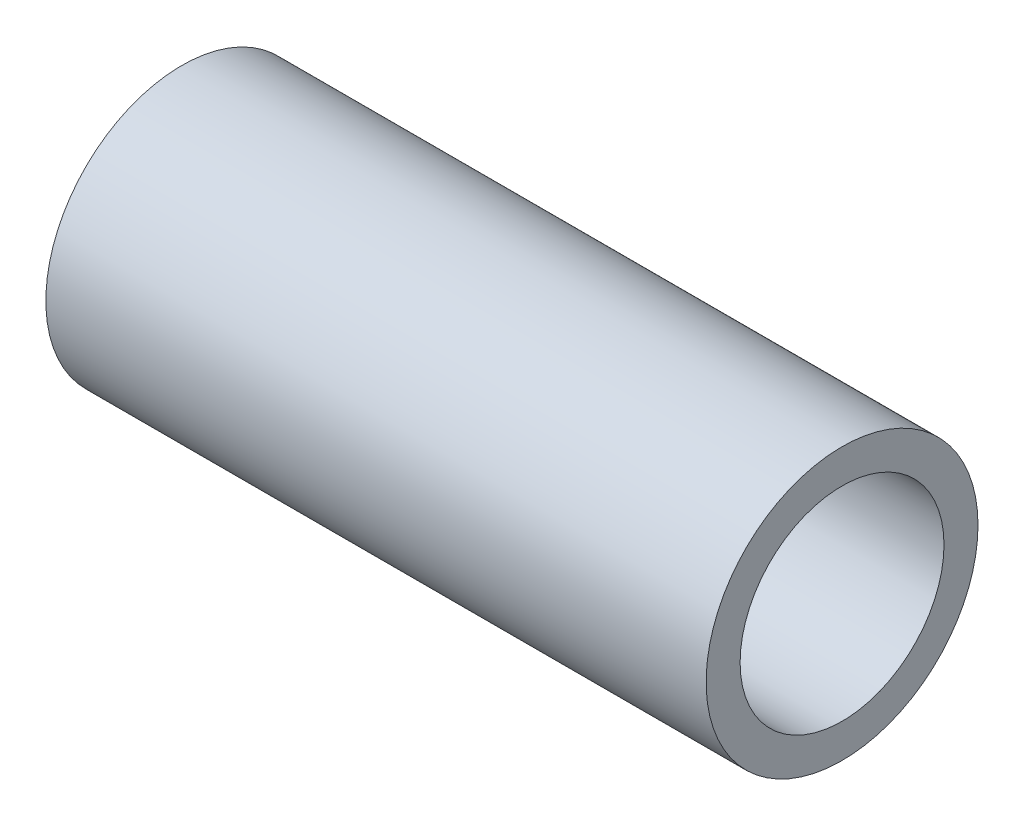
ISO-10303-21;
HEADER;
FILE_DESCRIPTION(('STEP AP214'),'2;1');
FILE_NAME('part.step','',(''),(''),'','','');
FILE_SCHEMA(('AUTOMOTIVE_DESIGN { 1 0 10303 214 1 1 1 1 }'));
ENDSEC;
DATA;
#1=APPLICATION_CONTEXT('core data for automotive mechanical design processes');
#2=APPLICATION_PROTOCOL_DEFINITION('international standard','automotive_design',2000,#1);
#3=PRODUCT_CONTEXT('',#1,'mechanical');
#4=PRODUCT('Part','Part','',(#3));
#5=PRODUCT_RELATED_PRODUCT_CATEGORY('part','',(#4));
#6=PRODUCT_DEFINITION_FORMATION('','',#4);
#7=PRODUCT_DEFINITION_CONTEXT('part definition',#1,'design');
#8=PRODUCT_DEFINITION('design','',#6,#7);
#9=PRODUCT_DEFINITION_SHAPE('','',#8);
#10=(LENGTH_UNIT() NAMED_UNIT(*) SI_UNIT(.MILLI.,.METRE.));
#11=(NAMED_UNIT(*) PLANE_ANGLE_UNIT() SI_UNIT($,.RADIAN.));
#12=(NAMED_UNIT(*) SI_UNIT($,.STERADIAN.) SOLID_ANGLE_UNIT());
#13=UNCERTAINTY_MEASURE_WITH_UNIT(LENGTH_MEASURE(1.E-05),#10,'distance_accuracy_value','');
#14=(GEOMETRIC_REPRESENTATION_CONTEXT(3) GLOBAL_UNCERTAINTY_ASSIGNED_CONTEXT((#13)) GLOBAL_UNIT_ASSIGNED_CONTEXT((#10,
#11,#12)) REPRESENTATION_CONTEXT('',''));
#15=CARTESIAN_POINT('',(0.,0.,0.));
#16=DIRECTION('',(0.,0.,1.));
#17=DIRECTION('',(1.,0.,0.));
#18=AXIS2_PLACEMENT_3D('',#15,#16,#17);
#19=CARTESIAN_POINT('',(34.,0.,0.));
#20=DIRECTION('',(1.,0.,0.));
#21=DIRECTION('',(0.,0.,-1.));
#22=AXIS2_PLACEMENT_3D('',#19,#20,#21);
#23=PLANE('',#22);
#24=CARTESIAN_POINT('',(34.,0.,0.));
#25=DIRECTION('',(1.,0.,0.));
#26=DIRECTION('',(0.,0.,-1.));
#27=AXIS2_PLACEMENT_3D('',#24,#25,#26);
#28=CIRCLE('',#27,7.);
#29=CARTESIAN_POINT('',(34.,0.,-7.));
#30=VERTEX_POINT('',#29);
#31=EDGE_CURVE('E10',#30,#30,#28,.T.);
#32=ORIENTED_EDGE('',*,*,#31,.T.);
#33=EDGE_LOOP('',(#32));
#34=FACE_BOUND('',#33,.T.);
#35=CARTESIAN_POINT('',(34.,0.,0.));
#36=DIRECTION('',(1.,0.,0.));
#37=DIRECTION('',(0.,0.,-1.));
#38=AXIS2_PLACEMENT_3D('',#35,#36,#37);
#39=CIRCLE('',#38,5.25);
#40=CARTESIAN_POINT('',(34.,0.,-5.25));
#41=VERTEX_POINT('',#40);
#42=EDGE_CURVE('E54',#41,#41,#39,.T.);
#43=ORIENTED_EDGE('',*,*,#42,.F.);
#44=EDGE_LOOP('',(#43));
#45=FACE_BOUND('',#44,.T.);
#46=ADVANCED_FACE('F41',(#34,#45),#23,.T.);
#47=CARTESIAN_POINT('',(0.,0.,0.));
#48=DIRECTION('',(1.,0.,0.));
#49=DIRECTION('',(0.,0.,-1.));
#50=AXIS2_PLACEMENT_3D('',#47,#48,#49);
#51=PLANE('',#50);
#52=CARTESIAN_POINT('',(0.,0.,0.));
#53=DIRECTION('',(1.,0.,0.));
#54=DIRECTION('',(0.,0.,-1.));
#55=AXIS2_PLACEMENT_3D('',#52,#53,#54);
#56=CIRCLE('',#55,7.);
#57=CARTESIAN_POINT('',(0.,0.,-7.));
#58=VERTEX_POINT('',#57);
#59=EDGE_CURVE('E45',#58,#58,#56,.T.);
#60=ORIENTED_EDGE('',*,*,#59,.F.);
#61=EDGE_LOOP('',(#60));
#62=FACE_BOUND('',#61,.T.);
#63=CARTESIAN_POINT('',(0.,0.,0.));
#64=DIRECTION('',(1.,0.,0.));
#65=DIRECTION('',(0.,0.,-1.));
#66=AXIS2_PLACEMENT_3D('',#63,#64,#65);
#67=CIRCLE('',#66,5.25);
#68=CARTESIAN_POINT('',(0.,0.,-5.25));
#69=VERTEX_POINT('',#68);
#70=EDGE_CURVE('E56',#69,#69,#67,.T.);
#71=ORIENTED_EDGE('',*,*,#70,.T.);
#72=EDGE_LOOP('',(#71));
#73=FACE_BOUND('',#72,.T.);
#74=ADVANCED_FACE('F68',(#62,#73),#51,.F.);
#75=CARTESIAN_POINT('',(34.,0.,0.));
#76=DIRECTION('',(-1.,0.,0.));
#77=DIRECTION('',(0.,0.,1.));
#78=AXIS2_PLACEMENT_3D('',#75,#76,#77);
#79=CYLINDRICAL_SURFACE('',#78,7.);
#80=ORIENTED_EDGE('',*,*,#31,.F.);
#81=EDGE_LOOP('',(#80));
#82=FACE_BOUND('',#81,.T.);
#83=ORIENTED_EDGE('',*,*,#59,.T.);
#84=EDGE_LOOP('',(#83));
#85=FACE_BOUND('',#84,.T.);
#86=ADVANCED_FACE('F43',(#82,#85),#79,.T.);
#87=CARTESIAN_POINT('',(34.,0.,0.));
#88=DIRECTION('',(-1.,0.,0.));
#89=DIRECTION('',(0.,0.,1.));
#90=AXIS2_PLACEMENT_3D('',#87,#88,#89);
#91=CYLINDRICAL_SURFACE('',#90,5.25);
#92=ORIENTED_EDGE('',*,*,#42,.T.);
#93=EDGE_LOOP('',(#92));
#94=FACE_BOUND('',#93,.T.);
#95=ORIENTED_EDGE('',*,*,#70,.F.);
#96=EDGE_LOOP('',(#95));
#97=FACE_BOUND('',#96,.T.);
#98=ADVANCED_FACE('F64',(#94,#97),#91,.F.);
#99=CLOSED_SHELL('',(#46,#74,#86,#98));
#100=MANIFOLD_SOLID_BREP('B2',#99);
#101=ADVANCED_BREP_SHAPE_REPRESENTATION('',(#18,#100),#14);
#102=SHAPE_DEFINITION_REPRESENTATION(#9,#101);
ENDSEC;
END-ISO-10303-21;
